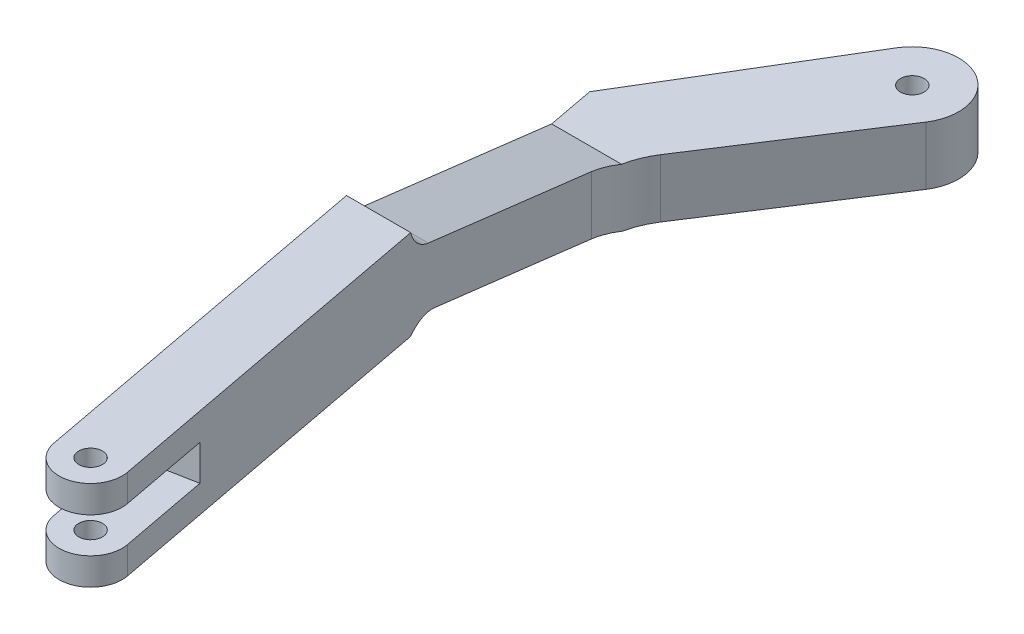
ISO-10303-21;
HEADER;
FILE_DESCRIPTION(('STEP AP214'),'2;1');
FILE_NAME('part.step','',(''),(''),'','','');
FILE_SCHEMA(('AUTOMOTIVE_DESIGN { 1 0 10303 214 1 1 1 1 }'));
ENDSEC;
DATA;
#1=APPLICATION_CONTEXT('core data for automotive mechanical design processes');
#2=APPLICATION_PROTOCOL_DEFINITION('international standard','automotive_design',2000,#1);
#3=PRODUCT_CONTEXT('',#1,'mechanical');
#4=PRODUCT('Part','Part','',(#3));
#5=PRODUCT_RELATED_PRODUCT_CATEGORY('part','',(#4));
#6=PRODUCT_DEFINITION_FORMATION('','',#4);
#7=PRODUCT_DEFINITION_CONTEXT('part definition',#1,'design');
#8=PRODUCT_DEFINITION('design','',#6,#7);
#9=PRODUCT_DEFINITION_SHAPE('','',#8);
#10=(LENGTH_UNIT() NAMED_UNIT(*) SI_UNIT(.MILLI.,.METRE.));
#11=(NAMED_UNIT(*) PLANE_ANGLE_UNIT() SI_UNIT($,.RADIAN.));
#12=(NAMED_UNIT(*) SI_UNIT($,.STERADIAN.) SOLID_ANGLE_UNIT());
#13=UNCERTAINTY_MEASURE_WITH_UNIT(LENGTH_MEASURE(1.E-05),#10,'distance_accuracy_value','');
#14=(GEOMETRIC_REPRESENTATION_CONTEXT(3) GLOBAL_UNCERTAINTY_ASSIGNED_CONTEXT((#13)) GLOBAL_UNIT_ASSIGNED_CONTEXT((#10,
#11,#12)) REPRESENTATION_CONTEXT('',''));
#15=CARTESIAN_POINT('',(0.,0.,0.));
#16=DIRECTION('',(0.,0.,1.));
#17=DIRECTION('',(1.,0.,0.));
#18=AXIS2_PLACEMENT_3D('',#15,#16,#17);
#19=CARTESIAN_POINT('',(-9.53179867765732,3.475,3.83529609746282));
#20=DIRECTION('',(0.,-1.,0.));
#21=DIRECTION('',(0.,0.,-1.));
#22=AXIS2_PLACEMENT_3D('',#19,#20,#21);
#23=PLANE('',#22);
#24=DIRECTION('',(0.185556850741548,0.,0.982633530438932));
#25=VECTOR('',#24,1.);
#26=CARTESIAN_POINT('',(1.96526706087786,3.475,-0.371113701483095));
#27=LINE('',#26,#25);
#28=CARTESIAN_POINT('',(0.895770328900771,3.475,-6.03473293912214));
#29=VERTEX_POINT('',#28);
#30=CARTESIAN_POINT('',(1.96526706087786,3.475,-0.371113701483095));
#31=VERTEX_POINT('',#30);
#32=EDGE_CURVE('E390',#29,#31,#27,.T.);
#33=ORIENTED_EDGE('',*,*,#32,.F.);
#34=DIRECTION('',(0.982633530438932,0.,-0.185556850741548));
#35=VECTOR('',#34,1.);
#36=CARTESIAN_POINT('',(-10.9724091111175,3.475,-3.79359020105409));
#37=LINE('',#36,#35);
#38=CARTESIAN_POINT('',(-3.03476379285495,3.475,-5.29250553615595));
#39=VERTEX_POINT('',#38);
#40=EDGE_CURVE('E222',#39,#29,#37,.T.);
#41=ORIENTED_EDGE('',*,*,#40,.F.);
#42=DIRECTION('',(-0.185556850741548,0.,-0.982633530438932));
#43=VECTOR('',#42,1.);
#44=CARTESIAN_POINT('',(-1.96526706087786,3.475,0.371113701483096));
#45=LINE('',#44,#43);
#46=CARTESIAN_POINT('',(-1.96526706087786,3.475,0.371113701483095));
#47=VERTEX_POINT('',#46);
#48=EDGE_CURVE('E225',#47,#39,#45,.T.);
#49=ORIENTED_EDGE('',*,*,#48,.F.);
#50=CARTESIAN_POINT('',(0.,3.475,0.));
#51=DIRECTION('',(0.,-1.,0.));
#52=DIRECTION('',(0.,0.,-1.));
#53=AXIS2_PLACEMENT_3D('',#50,#51,#52);
#54=CIRCLE('',#53,2.);
#55=EDGE_CURVE('E169',#31,#47,#54,.T.);
#56=ORIENTED_EDGE('',*,*,#55,.F.);
#57=EDGE_LOOP('',(#33,#41,#49,#56));
#58=FACE_BOUND('',#57,.T.);
#59=CARTESIAN_POINT('',(0.,3.475,0.));
#60=DIRECTION('',(0.,1.,0.));
#61=DIRECTION('',(0.,0.,1.));
#62=AXIS2_PLACEMENT_3D('',#59,#60,#61);
#63=CIRCLE('',#62,0.75);
#64=CARTESIAN_POINT('',(0.,3.475,0.75));
#65=VERTEX_POINT('',#64);
#66=EDGE_CURVE('E193',#65,#65,#63,.T.);
#67=ORIENTED_EDGE('',*,*,#66,.F.);
#68=EDGE_LOOP('',(#67));
#69=FACE_BOUND('',#68,.T.);
#70=ADVANCED_FACE('F45',(#58,#69),#23,.F.);
#71=CARTESIAN_POINT('',(0.,11.,0.));
#72=DIRECTION('',(0.,-1.,0.));
#73=DIRECTION('',(0.,0.,-1.));
#74=AXIS2_PLACEMENT_3D('',#71,#72,#73);
#75=CYLINDRICAL_SURFACE('',#74,2.);
#76=CARTESIAN_POINT('',(0.,5.725,0.));
#77=DIRECTION('',(0.,1.,0.));
#78=DIRECTION('',(0.,0.,1.));
#79=AXIS2_PLACEMENT_3D('',#76,#77,#78);
#80=CIRCLE('',#79,2.);
#81=CARTESIAN_POINT('',(-1.96526706087786,5.725,0.371113701483095));
#82=VERTEX_POINT('',#81);
#83=CARTESIAN_POINT('',(1.96526706087786,5.725,-0.371113701483097));
#84=VERTEX_POINT('',#83);
#85=EDGE_CURVE('E234',#82,#84,#80,.T.);
#86=ORIENTED_EDGE('',*,*,#85,.T.);
#87=DIRECTION('',(0.,-1.,0.));
#88=VECTOR('',#87,1.);
#89=CARTESIAN_POINT('',(1.96526706087786,11.,-0.371113701483095));
#90=LINE('',#89,#88);
#91=CARTESIAN_POINT('',(1.96526706087786,7.45,-0.371113701483095));
#92=VERTEX_POINT('',#91);
#93=EDGE_CURVE('E175',#92,#84,#90,.T.);
#94=ORIENTED_EDGE('',*,*,#93,.F.);
#95=CARTESIAN_POINT('',(0.,7.45,0.));
#96=DIRECTION('',(0.,1.,0.));
#97=DIRECTION('',(0.,0.,1.));
#98=AXIS2_PLACEMENT_3D('',#95,#96,#97);
#99=CIRCLE('',#98,2.);
#100=CARTESIAN_POINT('',(-1.96526706087786,7.45,0.371113701483095));
#101=VERTEX_POINT('',#100);
#102=EDGE_CURVE('E199',#101,#92,#99,.T.);
#103=ORIENTED_EDGE('',*,*,#102,.F.);
#104=DIRECTION('',(0.,-1.,0.));
#105=VECTOR('',#104,1.);
#106=CARTESIAN_POINT('',(-1.96526706087786,11.,0.371113701483095));
#107=LINE('',#106,#105);
#108=EDGE_CURVE('E174',#101,#82,#107,.T.);
#109=ORIENTED_EDGE('',*,*,#108,.T.);
#110=EDGE_LOOP('',(#86,#94,#103,#109));
#111=FACE_BOUND('',#110,.T.);
#112=ADVANCED_FACE('F432',(#111),#75,.T.);
#113=CARTESIAN_POINT('',(10.,6.45,-22.5200010883989));
#114=DIRECTION('',(0.,-0.961261695938321,0.275637355816992));
#115=DIRECTION('',(0.,-0.275637355816992,-0.961261695938321));
#116=AXIS2_PLACEMENT_3D('',#113,#114,#115);
#117=PLANE('',#116);
#118=DIRECTION('',(0.178602453933735,0.271205470906492,0.945805876488001));
#119=VECTOR('',#118,1.);
#120=CARTESIAN_POINT('',(-5.76837346642499,7.23895461904974,-19.7685893543897));
#121=LINE('',#120,#119);
#122=CARTESIAN_POINT('',(-9.31727134036083,1.85,-38.5621075300675));
#123=VERTEX_POINT('',#122);
#124=CARTESIAN_POINT('',(-6.54814346938365,6.05488415308838,-23.8979337999089));
#125=VERTEX_POINT('',#124);
#126=EDGE_CURVE('E353',#123,#125,#121,.T.);
#127=ORIENTED_EDGE('',*,*,#126,.T.);
#128=DIRECTION('',(-1.,0.,0.));
#129=VECTOR('',#128,1.);
#130=CARTESIAN_POINT('',(10.,6.05488415308841,-23.8979337999088));
#131=LINE('',#130,#129);
#132=CARTESIAN_POINT('',(-2.4774498933022,6.05488415308838,-23.8979337999089));
#133=VERTEX_POINT('',#132);
#134=EDGE_CURVE('E408',#125,#133,#131,.F.);
#135=ORIENTED_EDGE('',*,*,#134,.T.);
#136=DIRECTION('',(-0.178602453933735,-0.271205470906492,-0.945805876488001));
#137=VECTOR('',#136,1.);
#138=CARTESIAN_POINT('',(-1.82753027937678,7.04177851575712,-20.4562241449926));
#139=LINE('',#138,#137);
#140=CARTESIAN_POINT('',(-4.89062914209682,2.39050328856824,-36.677148554571));
#141=VERTEX_POINT('',#140);
#142=EDGE_CURVE('E359',#133,#141,#139,.T.);
#143=ORIENTED_EDGE('',*,*,#142,.T.);
#144=CARTESIAN_POINT('',(0.0225385100978458,2.12446543483788,-37.6049328082787));
#145=DIRECTION('',(0.,-0.961261695938321,0.275637355816992));
#146=DIRECTION('',(0.,-0.275637355816992,-0.961261695938321));
#147=AXIS2_PLACEMENT_3D('',#144,#145,#146);
#148=ELLIPSE('',#147,5.201497179308,5.);
#149=CARTESIAN_POINT('',(-4.88498801066276,1.85,-38.5621075300675));
#150=VERTEX_POINT('',#149);
#151=EDGE_CURVE('E398',#141,#150,#148,.T.);
#152=ORIENTED_EDGE('',*,*,#151,.T.);
#153=DIRECTION('',(-1.,0.,0.));
#154=VECTOR('',#153,1.);
#155=CARTESIAN_POINT('',(10.,1.85,-38.5621075300675));
#156=LINE('',#155,#154);
#157=EDGE_CURVE('E358',#150,#123,#156,.T.);
#158=ORIENTED_EDGE('',*,*,#157,.T.);
#159=EDGE_LOOP('',(#127,#135,#143,#152,#158));
#160=FACE_BOUND('',#159,.T.);
#161=ADVANCED_FACE('F421',(#160),#117,.F.);
#162=CARTESIAN_POINT('',(1.96526706087786,1.75,-0.371113701483102));
#163=VERTEX_POINT('',#162);
#164=EDGE_CURVE('E269',#31,#163,#90,.T.);
#165=ORIENTED_EDGE('',*,*,#164,.F.);
#166=ORIENTED_EDGE('',*,*,#55,.T.);
#167=CARTESIAN_POINT('',(-1.96526706087786,1.75,0.371113701483101));
#168=VERTEX_POINT('',#167);
#169=EDGE_CURVE('E163',#47,#168,#107,.T.);
#170=ORIENTED_EDGE('',*,*,#169,.T.);
#171=CARTESIAN_POINT('',(0.,1.75,0.));
#172=DIRECTION('',(0.,-1.,0.));
#173=DIRECTION('',(0.,0.,-1.));
#174=AXIS2_PLACEMENT_3D('',#171,#172,#173);
#175=CIRCLE('',#174,2.);
#176=EDGE_CURVE('E168',#163,#168,#175,.T.);
#177=ORIENTED_EDGE('',*,*,#176,.F.);
#178=EDGE_LOOP('',(#165,#166,#170,#177));
#179=FACE_BOUND('',#178,.T.);
#180=ADVANCED_FACE('F166',(#179),#75,.T.);
#181=CARTESIAN_POINT('',(-1.96526706087786,11.,0.371113701483096));
#182=DIRECTION('',(0.982633530438932,0.,-0.185556850741548));
#183=DIRECTION('',(-0.185556850741548,0.,-0.982633530438932));
#184=AXIS2_PLACEMENT_3D('',#181,#182,#183);
#185=PLANE('',#184);
#186=DIRECTION('',(0.,1.,0.));
#187=VECTOR('',#186,1.);
#188=CARTESIAN_POINT('',(-3.03476379285495,11.,-5.29250553615595));
#189=LINE('',#188,#187);
#190=CARTESIAN_POINT('',(-3.03476379285495,5.725,-5.29250553615595));
#191=VERTEX_POINT('',#190);
#192=EDGE_CURVE('E229',#39,#191,#189,.T.);
#193=ORIENTED_EDGE('',*,*,#192,.T.);
#194=DIRECTION('',(0.185556850741548,0.,0.982633530438932));
#195=VECTOR('',#194,1.);
#196=CARTESIAN_POINT('',(-1.96526706087786,5.725,0.371113701483096));
#197=LINE('',#196,#195);
#198=EDGE_CURVE('E231',#191,#82,#197,.T.);
#199=ORIENTED_EDGE('',*,*,#198,.T.);
#200=ORIENTED_EDGE('',*,*,#108,.F.);
#201=DIRECTION('',(0.185556850741548,0.,0.982633530438932));
#202=VECTOR('',#201,1.);
#203=CARTESIAN_POINT('',(-6.2879397957238,7.45,-22.5200010883989));
#204=LINE('',#203,#202);
#205=CARTESIAN_POINT('',(-6.2879397957238,7.45,-22.5200010883989));
#206=VERTEX_POINT('',#205);
#207=EDGE_CURVE('E207',#206,#101,#204,.T.);
#208=ORIENTED_EDGE('',*,*,#207,.F.);
#209=CARTESIAN_POINT('',(-6.65224412971687,7.97740754496503,-24.4492085115429));
#210=DIRECTION('',(0.982633530438932,0.,-0.185556850741548));
#211=DIRECTION('',(-0.185556850741548,0.,-0.982633530438932));
#212=AXIS2_PLACEMENT_3D('',#209,#210,#211);
#213=ELLIPSE('',#212,2.03534678804073,2.);
#214=EDGE_CURVE('E414',#206,#125,#213,.T.);
#215=ORIENTED_EDGE('',*,*,#214,.T.);
#216=ORIENTED_EDGE('',*,*,#126,.F.);
#217=DIRECTION('',(-0.185556850741547,0.,-0.982633530438932));
#218=VECTOR('',#217,1.);
#219=CARTESIAN_POINT('',(-9.87836914719068,1.85,-41.5334530591782));
#220=LINE('',#219,#218);
#221=CARTESIAN_POINT('',(-9.87836914719068,1.85,-41.5334530591782));
#222=VERTEX_POINT('',#221);
#223=EDGE_CURVE('E245',#123,#222,#220,.T.);
#224=ORIENTED_EDGE('',*,*,#223,.T.);
#225=DIRECTION('',(0.,1.,0.));
#226=VECTOR('',#225,1.);
#227=CARTESIAN_POINT('',(-9.87836914719068,-1.85,-41.5334530591782));
#228=LINE('',#227,#226);
#229=CARTESIAN_POINT('',(-9.87836914719068,-1.85,-41.5334530591782));
#230=VERTEX_POINT('',#229);
#231=EDGE_CURVE('E252',#230,#222,#228,.T.);
#232=ORIENTED_EDGE('',*,*,#231,.F.);
#233=DIRECTION('',(-0.185556850741547,0.,-0.982633530438932));
#234=VECTOR('',#233,1.);
#235=CARTESIAN_POINT('',(-9.87836914719068,-1.85,-41.5334530591782));
#236=LINE('',#235,#234);
#237=CARTESIAN_POINT('',(-9.17711188603506,-1.85,-37.8198801271011));
#238=VERTEX_POINT('',#237);
#239=EDGE_CURVE('E250',#238,#230,#236,.T.);
#240=ORIENTED_EDGE('',*,*,#239,.F.);
#241=DIRECTION('',(0.178602453933735,0.271205470906492,0.945805876488001));
#242=VECTOR('',#241,1.);
#243=CARTESIAN_POINT('',(-1.87328779020083,9.24076056739867,0.85819846882732));
#244=LINE('',#243,#242);
#245=CARTESIAN_POINT('',(-6.50160438864937,2.21272285044614,-23.6514817771323));
#246=VERTEX_POINT('',#245);
#247=EDGE_CURVE('E238',#238,#246,#244,.T.);
#248=ORIENTED_EDGE('',*,*,#247,.T.);
#249=CARTESIAN_POINT('',(-6.4009563224788,0.287679897626247,-23.1184905984299));
#250=DIRECTION('',(0.982633530438932,0.,-0.185556850741548));
#251=DIRECTION('',(-0.185556850741548,0.,-0.982633530438932));
#252=AXIS2_PLACEMENT_3D('',#249,#250,#251);
#253=CIRCLE('',#252,2.);
#254=CARTESIAN_POINT('',(-6.14778034139803,1.75000000000001,-21.7777736854325));
#255=VERTEX_POINT('',#254);
#256=EDGE_CURVE('E13',#246,#255,#253,.T.);
#257=ORIENTED_EDGE('',*,*,#256,.T.);
#258=DIRECTION('',(-0.185556850741548,0.,-0.982633530438932));
#259=VECTOR('',#258,1.);
#260=CARTESIAN_POINT('',(-1.96526706087786,1.75,0.371113701483101));
#261=LINE('',#260,#259);
#262=EDGE_CURVE('E178',#168,#255,#261,.T.);
#263=ORIENTED_EDGE('',*,*,#262,.F.);
#264=ORIENTED_EDGE('',*,*,#169,.F.);
#265=ORIENTED_EDGE('',*,*,#48,.T.);
#266=EDGE_LOOP('',(#193,#199,#200,#208,#215,#216,#224,#232,#240,#248,#257,#263,#264,#265));
#267=FACE_BOUND('',#266,.T.);
#268=ADVANCED_FACE('F180',(#267),#185,.F.);
#269=CARTESIAN_POINT('',(1.96526706087786,11.,-0.371113701483095));
#270=DIRECTION('',(-0.982633530438932,0.,0.185556850741548));
#271=DIRECTION('',(0.185556850741548,0.,0.982633530438932));
#272=AXIS2_PLACEMENT_3D('',#269,#270,#271);
#273=PLANE('',#272);
#274=DIRECTION('',(0.178602453933735,0.271205470906492,0.945805876488001));
#275=VECTOR('',#274,1.);
#276=CARTESIAN_POINT('',(-5.24657776427936,-1.85,-38.5621075300673));
#277=LINE('',#276,#275);
#278=CARTESIAN_POINT('',(-4.89062914209681,-1.3094967114318,-36.677148554571));
#279=VERTEX_POINT('',#278);
#280=CARTESIAN_POINT('',(-2.57107026689365,2.21272285044614,-24.3937091800985));
#281=VERTEX_POINT('',#280);
#282=EDGE_CURVE('E236',#279,#281,#277,.T.);
#283=ORIENTED_EDGE('',*,*,#282,.F.);
#284=DIRECTION('',(0.,1.,0.));
#285=VECTOR('',#284,1.);
#286=CARTESIAN_POINT('',(-4.89062914209682,1.85,-36.677148554571));
#287=LINE('',#286,#285);
#288=EDGE_CURVE('E393',#279,#141,#287,.T.);
#289=ORIENTED_EDGE('',*,*,#288,.T.);
#290=ORIENTED_EDGE('',*,*,#142,.F.);
#291=CARTESIAN_POINT('',(-2.58155055363541,7.97740754496503,-24.4492085115429));
#292=DIRECTION('',(-0.982633530438932,0.,0.185556850741548));
#293=DIRECTION('',(-0.185556850741548,0.,-0.982633530438932));
#294=AXIS2_PLACEMENT_3D('',#291,#292,#293);
#295=ELLIPSE('',#294,2.03534678804073,2.);
#296=CARTESIAN_POINT('',(-2.21724621964234,7.45,-22.5200010883989));
#297=VERTEX_POINT('',#296);
#298=EDGE_CURVE('E412',#133,#297,#295,.T.);
#299=ORIENTED_EDGE('',*,*,#298,.T.);
#300=DIRECTION('',(-0.185556850741548,0.,-0.982633530438932));
#301=VECTOR('',#300,1.);
#302=CARTESIAN_POINT('',(1.96526706087786,7.45,-0.371113701483095));
#303=LINE('',#302,#301);
#304=EDGE_CURVE('E202',#92,#297,#303,.T.);
#305=ORIENTED_EDGE('',*,*,#304,.F.);
#306=ORIENTED_EDGE('',*,*,#93,.T.);
#307=DIRECTION('',(0.185556850741548,0.,0.982633530438932));
#308=VECTOR('',#307,1.);
#309=CARTESIAN_POINT('',(0.895770328900771,5.725,-6.03473293912214));
#310=LINE('',#309,#308);
#311=CARTESIAN_POINT('',(0.895770328900771,5.725,-6.03473293912214));
#312=VERTEX_POINT('',#311);
#313=EDGE_CURVE('E216',#312,#84,#310,.T.);
#314=ORIENTED_EDGE('',*,*,#313,.F.);
#315=DIRECTION('',(0.,1.,0.));
#316=VECTOR('',#315,1.);
#317=CARTESIAN_POINT('',(0.895770328900771,3.475,-6.03473293912214));
#318=LINE('',#317,#316);
#319=EDGE_CURVE('E219',#29,#312,#318,.T.);
#320=ORIENTED_EDGE('',*,*,#319,.F.);
#321=ORIENTED_EDGE('',*,*,#32,.T.);
#322=ORIENTED_EDGE('',*,*,#164,.T.);
#323=DIRECTION('',(0.185556850741548,0.,0.982633530438932));
#324=VECTOR('',#323,1.);
#325=CARTESIAN_POINT('',(-2.2172462196423,1.75000000000001,-22.5200010883987));
#326=LINE('',#325,#324);
#327=CARTESIAN_POINT('',(-2.2172462196423,1.75000000000001,-22.5200010883987));
#328=VERTEX_POINT('',#327);
#329=EDGE_CURVE('E189',#328,#163,#326,.T.);
#330=ORIENTED_EDGE('',*,*,#329,.F.);
#331=CARTESIAN_POINT('',(-2.47042220072307,0.287679897626247,-23.8607180013961));
#332=DIRECTION('',(-0.982633530438932,0.,0.185556850741548));
#333=DIRECTION('',(0.185556850741548,0.,0.982633530438932));
#334=AXIS2_PLACEMENT_3D('',#331,#332,#333);
#335=CIRCLE('',#334,2.);
#336=EDGE_CURVE('E53',#328,#281,#335,.T.);
#337=ORIENTED_EDGE('',*,*,#336,.T.);
#338=EDGE_LOOP('',(#283,#289,#290,#299,#305,#306,#314,#320,#321,#322,#330,#337));
#339=FACE_BOUND('',#338,.T.);
#340=ADVANCED_FACE('F426',(#339),#273,.F.);
#341=CARTESIAN_POINT('',(-0.371113701483095,1.85,-1.96526706087786));
#342=DIRECTION('',(0.,1.,0.));
#343=DIRECTION('',(0.,0.,1.));
#344=AXIS2_PLACEMENT_3D('',#341,#342,#343);
#345=PLANE('',#344);
#346=CARTESIAN_POINT('',(0.,1.85,-52.12));
#347=DIRECTION('',(0.,1.,0.));
#348=DIRECTION('',(0.,0.,1.));
#349=AXIS2_PLACEMENT_3D('',#346,#347,#348);
#350=CIRCLE('',#349,0.749999999999998);
#351=CARTESIAN_POINT('',(0.,1.85,-51.37));
#352=VERTEX_POINT('',#351);
#353=EDGE_CURVE('E213',#352,#352,#350,.T.);
#354=ORIENTED_EDGE('',*,*,#353,.F.);
#355=EDGE_LOOP('',(#354));
#356=FACE_BOUND('',#355,.T.);
#357=ORIENTED_EDGE('',*,*,#157,.F.);
#358=CARTESIAN_POINT('',(0.0225385100978458,1.85,-37.6049328082787));
#359=DIRECTION('',(0.,1.,0.));
#360=DIRECTION('',(0.,0.,1.));
#361=AXIS2_PLACEMENT_3D('',#358,#359,#360);
#362=CIRCLE('',#361,5.);
#363=CARTESIAN_POINT('',(-4.17172136167121,1.85,-40.3267307669942));
#364=VERTEX_POINT('',#363);
#365=EDGE_CURVE('E401',#150,#364,#362,.F.);
#366=ORIENTED_EDGE('',*,*,#365,.T.);
#367=DIRECTION('',(-0.544359591743099,0.,0.838851974353811));
#368=VECTOR('',#367,1.);
#369=CARTESIAN_POINT('',(-5.26241633451627,1.85,-38.6459821492301));
#370=LINE('',#369,#368);
#371=CARTESIAN_POINT('',(2.44823430727143,1.85,-50.5280075833821));
#372=VERTEX_POINT('',#371);
#373=EDGE_CURVE('E257',#372,#364,#370,.T.);
#374=ORIENTED_EDGE('',*,*,#373,.F.);
#375=CARTESIAN_POINT('',(-0.0334172703077657,1.85,-52.1384357410559));
#376=DIRECTION('',(0.,-1.,0.));
#377=DIRECTION('',(0.,0.,1.));
#378=AXIS2_PLACEMENT_3D('',#375,#376,#377);
#379=CIRCLE('',#378,2.95839033995346);
#380=CARTESIAN_POINT('',(-2.56726989733297,1.85,-53.6654145451155));
#381=VERTEX_POINT('',#380);
#382=EDGE_CURVE('E255',#381,#372,#379,.T.);
#383=ORIENTED_EDGE('',*,*,#382,.F.);
#384=DIRECTION('',(0.516151903093238,0.,-0.856497059500631));
#385=VECTOR('',#384,1.);
#386=CARTESIAN_POINT('',(-2.56726989733297,1.85,-53.6654145451155));
#387=LINE('',#386,#385);
#388=EDGE_CURVE('E240',#222,#381,#387,.T.);
#389=ORIENTED_EDGE('',*,*,#388,.F.);
#390=ORIENTED_EDGE('',*,*,#223,.F.);
#391=EDGE_LOOP('',(#357,#366,#374,#383,#389,#390));
#392=FACE_BOUND('',#391,.T.);
#393=ADVANCED_FACE('F524',(#356,#392),#345,.T.);
#394=CARTESIAN_POINT('',(-2.56726989733297,-1.85,-53.6654145451155));
#395=DIRECTION('',(0.856497059500632,0.,0.516151903093238));
#396=DIRECTION('',(0.516151903093238,0.,-0.856497059500632));
#397=AXIS2_PLACEMENT_3D('',#394,#395,#396);
#398=PLANE('',#397);
#399=ORIENTED_EDGE('',*,*,#388,.T.);
#400=DIRECTION('',(0.,1.,0.));
#401=VECTOR('',#400,1.);
#402=CARTESIAN_POINT('',(-2.56726989733297,-1.85,-53.6654145451155));
#403=LINE('',#402,#401);
#404=CARTESIAN_POINT('',(-2.56726989733297,-1.85,-53.6654145451155));
#405=VERTEX_POINT('',#404);
#406=EDGE_CURVE('E266',#405,#381,#403,.T.);
#407=ORIENTED_EDGE('',*,*,#406,.F.);
#408=DIRECTION('',(0.516151903093238,0.,-0.856497059500631));
#409=VECTOR('',#408,1.);
#410=CARTESIAN_POINT('',(-2.56726989733297,-1.85,-53.6654145451155));
#411=LINE('',#410,#409);
#412=EDGE_CURVE('E241',#230,#405,#411,.T.);
#413=ORIENTED_EDGE('',*,*,#412,.F.);
#414=ORIENTED_EDGE('',*,*,#231,.T.);
#415=EDGE_LOOP('',(#399,#407,#413,#414));
#416=FACE_BOUND('',#415,.T.);
#417=ADVANCED_FACE('F537',(#416),#398,.F.);
#418=CARTESIAN_POINT('',(-0.0334172703077657,-1.85,-52.1384357410559));
#419=DIRECTION('',(0.,1.,0.));
#420=DIRECTION('',(0.,0.,1.));
#421=AXIS2_PLACEMENT_3D('',#418,#419,#420);
#422=CYLINDRICAL_SURFACE('',#421,2.95839033995346);
#423=ORIENTED_EDGE('',*,*,#382,.T.);
#424=DIRECTION('',(0.,1.,0.));
#425=VECTOR('',#424,1.);
#426=CARTESIAN_POINT('',(2.44823430727143,-1.85,-50.5280075833821));
#427=LINE('',#426,#425);
#428=CARTESIAN_POINT('',(2.44823430727143,-1.85,-50.5280075833821));
#429=VERTEX_POINT('',#428);
#430=EDGE_CURVE('E263',#429,#372,#427,.T.);
#431=ORIENTED_EDGE('',*,*,#430,.F.);
#432=CARTESIAN_POINT('',(-0.0334172703077657,-1.85,-52.1384357410559));
#433=DIRECTION('',(0.,-1.,0.));
#434=DIRECTION('',(0.,0.,1.));
#435=AXIS2_PLACEMENT_3D('',#432,#433,#434);
#436=CIRCLE('',#435,2.95839033995346);
#437=EDGE_CURVE('E244',#405,#429,#436,.T.);
#438=ORIENTED_EDGE('',*,*,#437,.F.);
#439=ORIENTED_EDGE('',*,*,#406,.T.);
#440=EDGE_LOOP('',(#423,#431,#438,#439));
#441=FACE_BOUND('',#440,.T.);
#442=ADVANCED_FACE('F548',(#441),#422,.T.);
#443=CARTESIAN_POINT('',(-5.26241633451627,-1.85,-38.6459821492301));
#444=DIRECTION('',(-0.838851974353811,0.,-0.544359591743099));
#445=DIRECTION('',(-0.544359591743099,0.,0.838851974353811));
#446=AXIS2_PLACEMENT_3D('',#443,#444,#445);
#447=PLANE('',#446);
#448=ORIENTED_EDGE('',*,*,#373,.T.);
#449=DIRECTION('',(0.,1.,0.));
#450=VECTOR('',#449,1.);
#451=CARTESIAN_POINT('',(-4.17172136167121,-1.85,-40.3267307669942));
#452=LINE('',#451,#450);
#453=CARTESIAN_POINT('',(-4.17172136167121,-1.85,-40.3267307669942));
#454=VERTEX_POINT('',#453);
#455=EDGE_CURVE('E396',#364,#454,#452,.F.);
#456=ORIENTED_EDGE('',*,*,#455,.T.);
#457=DIRECTION('',(-0.544359591743099,0.,0.838851974353811));
#458=VECTOR('',#457,1.);
#459=CARTESIAN_POINT('',(-5.26241633451627,-1.85,-38.6459821492301));
#460=LINE('',#459,#458);
#461=EDGE_CURVE('E247',#429,#454,#460,.T.);
#462=ORIENTED_EDGE('',*,*,#461,.F.);
#463=ORIENTED_EDGE('',*,*,#430,.T.);
#464=EDGE_LOOP('',(#448,#456,#462,#463));
#465=FACE_BOUND('',#464,.T.);
#466=ADVANCED_FACE('F557',(#465),#447,.F.);
#467=CARTESIAN_POINT('',(-0.371113701483095,-1.85,-1.96526706087786));
#468=DIRECTION('',(0.,1.,0.));
#469=DIRECTION('',(0.,0.,1.));
#470=AXIS2_PLACEMENT_3D('',#467,#468,#469);
#471=PLANE('',#470);
#472=CARTESIAN_POINT('',(0.,-1.85,-52.12));
#473=DIRECTION('',(0.,-1.,0.));
#474=DIRECTION('',(0.,0.,-1.));
#475=AXIS2_PLACEMENT_3D('',#472,#473,#474);
#476=CIRCLE('',#475,0.749999999999999);
#477=CARTESIAN_POINT('',(0.,-1.85,-52.87));
#478=VERTEX_POINT('',#477);
#479=EDGE_CURVE('E210',#478,#478,#476,.T.);
#480=ORIENTED_EDGE('',*,*,#479,.F.);
#481=EDGE_LOOP('',(#480));
#482=FACE_BOUND('',#481,.T.);
#483=ORIENTED_EDGE('',*,*,#461,.T.);
#484=CARTESIAN_POINT('',(0.0225385100978458,-1.85,-37.6049328082787));
#485=DIRECTION('',(0.,1.,0.));
#486=DIRECTION('',(0.,0.,1.));
#487=AXIS2_PLACEMENT_3D('',#484,#485,#486);
#488=CIRCLE('',#487,5.);
#489=CARTESIAN_POINT('',(-4.87060594643745,-1.85,-38.633104645803));
#490=VERTEX_POINT('',#489);
#491=EDGE_CURVE('E403',#454,#490,#488,.T.);
#492=ORIENTED_EDGE('',*,*,#491,.T.);
#493=DIRECTION('',(-0.982633530438932,0.,0.185556850741548));
#494=VECTOR('',#493,1.);
#495=CARTESIAN_POINT('',(-7.21184482515722,-1.85,-38.1909938285842));
#496=LINE('',#495,#494);
#497=EDGE_CURVE('E387',#490,#238,#496,.T.);
#498=ORIENTED_EDGE('',*,*,#497,.T.);
#499=ORIENTED_EDGE('',*,*,#239,.T.);
#500=ORIENTED_EDGE('',*,*,#412,.T.);
#501=ORIENTED_EDGE('',*,*,#437,.T.);
#502=EDGE_LOOP('',(#483,#492,#498,#499,#500,#501));
#503=FACE_BOUND('',#502,.T.);
#504=ADVANCED_FACE('F566',(#482,#503),#471,.F.);
#505=CARTESIAN_POINT('',(-17.1147572042976,-1.85,-36.3209647919993));
#506=DIRECTION('',(-0.0503240330852871,0.962521476409949,-0.266495589351199));
#507=DIRECTION('',(0.,0.266833682802018,0.963742593082983));
#508=AXIS2_PLACEMENT_3D('',#505,#506,#507);
#509=PLANE('',#508);
#510=ORIENTED_EDGE('',*,*,#282,.T.);
#511=DIRECTION('',(0.982633530438932,0.,-0.185556850741548));
#512=VECTOR('',#511,1.);
#513=CARTESIAN_POINT('',(-14.4392497069119,2.21272285044615,-22.1525664420305));
#514=LINE('',#513,#512);
#515=EDGE_CURVE('E60',#281,#246,#514,.F.);
#516=ORIENTED_EDGE('',*,*,#515,.T.);
#517=ORIENTED_EDGE('',*,*,#247,.F.);
#518=ORIENTED_EDGE('',*,*,#497,.F.);
#519=CARTESIAN_POINT('',(0.0225385100978458,-1.3094967114318,-37.6049328082787));
#520=DIRECTION('',(-0.0503240330852871,0.962521476409949,-0.266495589351199));
#521=DIRECTION('',(-0.178602453933735,-0.271205470906492,-0.945805876488001));
#522=AXIS2_PLACEMENT_3D('',#519,#520,#521);
#523=ELLIPSE('',#522,5.19468928490739,5.);
#524=EDGE_CURVE('E406',#490,#279,#523,.T.);
#525=ORIENTED_EDGE('',*,*,#524,.T.);
#526=EDGE_LOOP('',(#510,#516,#517,#518,#525));
#527=FACE_BOUND('',#526,.T.);
#528=ADVANCED_FACE('F574',(#527),#509,.F.);
#529=CARTESIAN_POINT('',(-10.9724091111175,5.725,-3.79359020105409));
#530=DIRECTION('',(0.,1.,0.));
#531=DIRECTION('',(0.,0.,1.));
#532=AXIS2_PLACEMENT_3D('',#529,#530,#531);
#533=PLANE('',#532);
#534=CARTESIAN_POINT('',(0.,5.725,0.));
#535=DIRECTION('',(0.,1.,0.));
#536=DIRECTION('',(0.,0.,1.));
#537=AXIS2_PLACEMENT_3D('',#534,#535,#536);
#538=CIRCLE('',#537,0.75);
#539=CARTESIAN_POINT('',(0.,5.725,0.75));
#540=VERTEX_POINT('',#539);
#541=EDGE_CURVE('E669',#540,#540,#538,.T.);
#542=ORIENTED_EDGE('',*,*,#541,.T.);
#543=EDGE_LOOP('',(#542));
#544=FACE_BOUND('',#543,.T.);
#545=ORIENTED_EDGE('',*,*,#85,.F.);
#546=ORIENTED_EDGE('',*,*,#198,.F.);
#547=DIRECTION('',(0.982633530438932,0.,-0.185556850741548));
#548=VECTOR('',#547,1.);
#549=CARTESIAN_POINT('',(-10.9724091111175,5.725,-3.79359020105409));
#550=LINE('',#549,#548);
#551=EDGE_CURVE('E223',#191,#312,#550,.T.);
#552=ORIENTED_EDGE('',*,*,#551,.T.);
#553=ORIENTED_EDGE('',*,*,#313,.T.);
#554=EDGE_LOOP('',(#545,#546,#552,#553));
#555=FACE_BOUND('',#554,.T.);
#556=ADVANCED_FACE('F436',(#544,#555),#533,.F.);
#557=CARTESIAN_POINT('',(-10.9724091111175,3.475,-3.79359020105409));
#558=DIRECTION('',(-0.185556850741548,0.,-0.982633530438932));
#559=DIRECTION('',(-0.982633530438932,0.,0.185556850741548));
#560=AXIS2_PLACEMENT_3D('',#557,#558,#559);
#561=PLANE('',#560);
#562=ORIENTED_EDGE('',*,*,#40,.T.);
#563=ORIENTED_EDGE('',*,*,#319,.T.);
#564=ORIENTED_EDGE('',*,*,#551,.F.);
#565=ORIENTED_EDGE('',*,*,#192,.F.);
#566=EDGE_LOOP('',(#562,#563,#564,#565));
#567=FACE_BOUND('',#566,.T.);
#568=ADVANCED_FACE('F439',(#567),#561,.F.);
#569=CARTESIAN_POINT('',(0.,-1.85,-52.12));
#570=DIRECTION('',(0.,-1.,0.));
#571=DIRECTION('',(0.,0.,-1.));
#572=AXIS2_PLACEMENT_3D('',#569,#570,#571);
#573=CYLINDRICAL_SURFACE('',#572,0.749999999999998);
#574=ORIENTED_EDGE('',*,*,#353,.T.);
#575=EDGE_LOOP('',(#574));
#576=FACE_BOUND('',#575,.T.);
#577=ORIENTED_EDGE('',*,*,#479,.T.);
#578=EDGE_LOOP('',(#577));
#579=FACE_BOUND('',#578,.T.);
#580=ADVANCED_FACE('F638',(#576,#579),#573,.F.);
#581=CARTESIAN_POINT('',(0.0225385100978458,11.,-37.6049328082787));
#582=DIRECTION('',(0.,-1.,0.));
#583=DIRECTION('',(0.,0.,-1.));
#584=AXIS2_PLACEMENT_3D('',#581,#582,#583);
#585=CYLINDRICAL_SURFACE('',#584,5.);
#586=ORIENTED_EDGE('',*,*,#491,.F.);
#587=ORIENTED_EDGE('',*,*,#455,.F.);
#588=ORIENTED_EDGE('',*,*,#365,.F.);
#589=ORIENTED_EDGE('',*,*,#151,.F.);
#590=ORIENTED_EDGE('',*,*,#288,.F.);
#591=ORIENTED_EDGE('',*,*,#524,.F.);
#592=EDGE_LOOP('',(#586,#587,#588,#589,#590,#591));
#593=FACE_BOUND('',#592,.T.);
#594=ADVANCED_FACE('F593',(#593),#585,.F.);
#595=CARTESIAN_POINT('',(0.,7.45,0.));
#596=DIRECTION('',(0.,1.,0.));
#597=DIRECTION('',(0.,0.,1.));
#598=AXIS2_PLACEMENT_3D('',#595,#596,#597);
#599=PLANE('',#598);
#600=CARTESIAN_POINT('',(0.,7.45,0.));
#601=DIRECTION('',(0.,1.,0.));
#602=DIRECTION('',(0.,0.,1.));
#603=AXIS2_PLACEMENT_3D('',#600,#601,#602);
#604=CIRCLE('',#603,0.75);
#605=CARTESIAN_POINT('',(0.,7.45,0.75));
#606=VERTEX_POINT('',#605);
#607=EDGE_CURVE('E672',#606,#606,#604,.T.);
#608=ORIENTED_EDGE('',*,*,#607,.F.);
#609=EDGE_LOOP('',(#608));
#610=FACE_BOUND('',#609,.T.);
#611=ORIENTED_EDGE('',*,*,#102,.T.);
#612=ORIENTED_EDGE('',*,*,#304,.T.);
#613=DIRECTION('',(-1.,0.,0.));
#614=VECTOR('',#613,1.);
#615=CARTESIAN_POINT('',(-2.21724621964234,7.45,-22.5200010883989));
#616=LINE('',#615,#614);
#617=EDGE_CURVE('E205',#297,#206,#616,.T.);
#618=ORIENTED_EDGE('',*,*,#617,.T.);
#619=ORIENTED_EDGE('',*,*,#207,.T.);
#620=EDGE_LOOP('',(#611,#612,#618,#619));
#621=FACE_BOUND('',#620,.T.);
#622=ADVANCED_FACE('F428',(#610,#621),#599,.T.);
#623=CARTESIAN_POINT('',(0.,1.75,0.));
#624=DIRECTION('',(0.,-1.,0.));
#625=DIRECTION('',(0.,0.,-1.));
#626=AXIS2_PLACEMENT_3D('',#623,#624,#625);
#627=PLANE('',#626);
#628=CARTESIAN_POINT('',(0.,1.75,0.));
#629=DIRECTION('',(0.,-1.,0.));
#630=DIRECTION('',(0.,0.,-1.));
#631=AXIS2_PLACEMENT_3D('',#628,#629,#630);
#632=CIRCLE('',#631,0.75);
#633=CARTESIAN_POINT('',(0.,1.75,-0.75));
#634=VERTEX_POINT('',#633);
#635=EDGE_CURVE('E190',#634,#634,#632,.T.);
#636=ORIENTED_EDGE('',*,*,#635,.F.);
#637=EDGE_LOOP('',(#636));
#638=FACE_BOUND('',#637,.T.);
#639=ORIENTED_EDGE('',*,*,#176,.T.);
#640=ORIENTED_EDGE('',*,*,#262,.T.);
#641=DIRECTION('',(0.982633530438932,0.,-0.185556850741548));
#642=VECTOR('',#641,1.);
#643=CARTESIAN_POINT('',(-6.14778034139803,1.75000000000001,-21.7777736854325));
#644=LINE('',#643,#642);
#645=EDGE_CURVE('E185',#255,#328,#644,.T.);
#646=ORIENTED_EDGE('',*,*,#645,.T.);
#647=ORIENTED_EDGE('',*,*,#329,.T.);
#648=EDGE_LOOP('',(#639,#640,#646,#647));
#649=FACE_BOUND('',#648,.T.);
#650=ADVANCED_FACE('F188',(#638,#649),#627,.T.);
#651=CARTESIAN_POINT('',(0.,3.475,0.));
#652=DIRECTION('',(0.,1.,0.));
#653=DIRECTION('',(0.,0.,1.));
#654=AXIS2_PLACEMENT_3D('',#651,#652,#653);
#655=CYLINDRICAL_SURFACE('',#654,0.75);
#656=ORIENTED_EDGE('',*,*,#66,.T.);
#657=EDGE_LOOP('',(#656));
#658=FACE_BOUND('',#657,.T.);
#659=ORIENTED_EDGE('',*,*,#635,.T.);
#660=EDGE_LOOP('',(#659));
#661=FACE_BOUND('',#660,.T.);
#662=ADVANCED_FACE('F604',(#658,#661),#655,.F.);
#663=CARTESIAN_POINT('',(0.,7.45,0.));
#664=DIRECTION('',(0.,1.,0.));
#665=DIRECTION('',(0.,0.,1.));
#666=AXIS2_PLACEMENT_3D('',#663,#664,#665);
#667=CYLINDRICAL_SURFACE('',#666,0.75);
#668=ORIENTED_EDGE('',*,*,#541,.F.);
#669=EDGE_LOOP('',(#668));
#670=FACE_BOUND('',#669,.T.);
#671=ORIENTED_EDGE('',*,*,#607,.T.);
#672=EDGE_LOOP('',(#671));
#673=FACE_BOUND('',#672,.T.);
#674=ADVANCED_FACE('F616',(#670,#673),#667,.F.);
#675=CARTESIAN_POINT('',(-2.21724621964233,7.97740754496503,-24.4492085115429));
#676=DIRECTION('',(-1.,0.,0.));
#677=DIRECTION('',(0.,0.,1.));
#678=AXIS2_PLACEMENT_3D('',#675,#676,#677);
#679=CYLINDRICAL_SURFACE('',#678,2.);
#680=ORIENTED_EDGE('',*,*,#214,.F.);
#681=ORIENTED_EDGE('',*,*,#617,.F.);
#682=ORIENTED_EDGE('',*,*,#298,.F.);
#683=ORIENTED_EDGE('',*,*,#134,.F.);
#684=EDGE_LOOP('',(#680,#681,#682,#683));
#685=FACE_BOUND('',#684,.T.);
#686=ADVANCED_FACE('F424',(#685),#679,.F.);
#687=CARTESIAN_POINT('',(-6.4009563224788,0.287679897626247,-23.1184905984299));
#688=DIRECTION('',(0.982633530438932,0.,-0.185556850741548));
#689=DIRECTION('',(-0.185556850741548,0.,-0.982633530438932));
#690=AXIS2_PLACEMENT_3D('',#687,#688,#689);
#691=CYLINDRICAL_SURFACE('',#690,2.);
#692=ORIENTED_EDGE('',*,*,#256,.F.);
#693=ORIENTED_EDGE('',*,*,#515,.F.);
#694=ORIENTED_EDGE('',*,*,#336,.F.);
#695=ORIENTED_EDGE('',*,*,#645,.F.);
#696=EDGE_LOOP('',(#692,#693,#694,#695));
#697=FACE_BOUND('',#696,.T.);
#698=ADVANCED_FACE('F47',(#697),#691,.F.);
#699=CLOSED_SHELL('',(#70,#112,#161,#180,#268,#340,#393,#417,#442,#466,#504,#528,#556,#568,#580,
#594,#622,#650,#662,#674,#686,#698));
#700=MANIFOLD_SOLID_BREP('B2',#699);
#701=ADVANCED_BREP_SHAPE_REPRESENTATION('',(#18,#700),#14);
#702=SHAPE_DEFINITION_REPRESENTATION(#9,#701);
ENDSEC;
END-ISO-10303-21;
